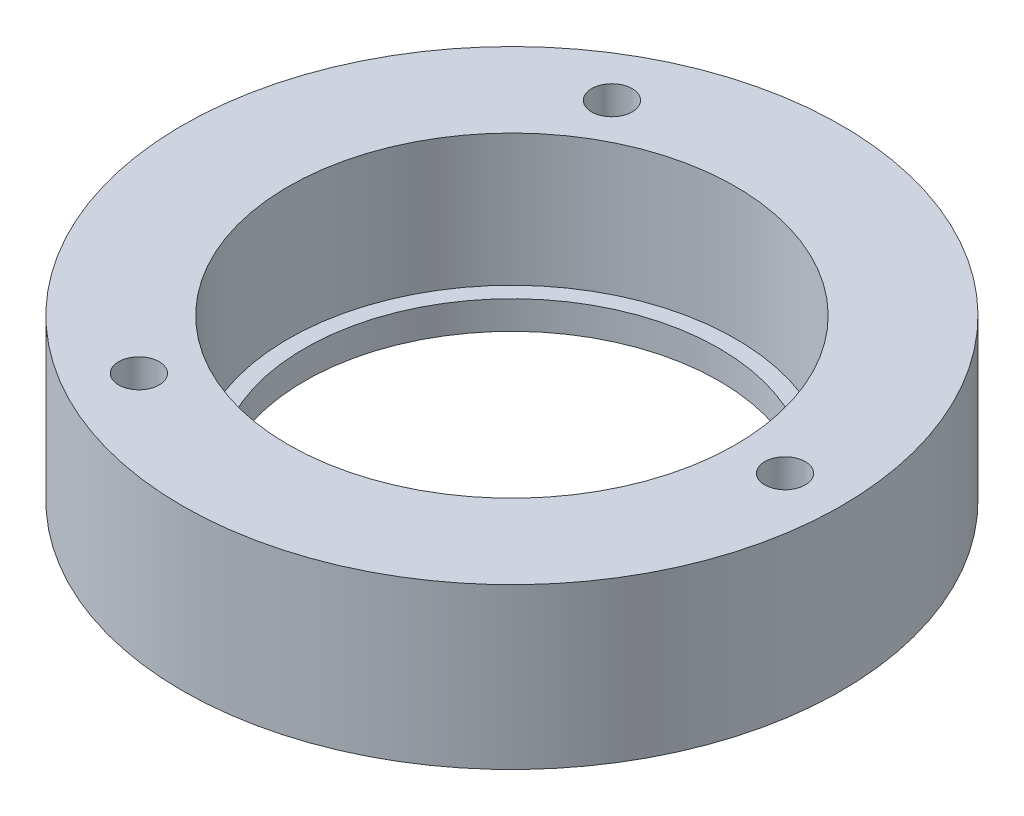
ISO-10303-21;
HEADER;
FILE_DESCRIPTION(('STEP AP214'),'2;1');
FILE_NAME('part.step','',(''),(''),'','','');
FILE_SCHEMA(('AUTOMOTIVE_DESIGN { 1 0 10303 214 1 1 1 1 }'));
ENDSEC;
DATA;
#1=APPLICATION_CONTEXT('core data for automotive mechanical design processes');
#2=APPLICATION_PROTOCOL_DEFINITION('international standard','automotive_design',2000,#1);
#3=PRODUCT_CONTEXT('',#1,'mechanical');
#4=PRODUCT('Part','Part','',(#3));
#5=PRODUCT_RELATED_PRODUCT_CATEGORY('part','',(#4));
#6=PRODUCT_DEFINITION_FORMATION('','',#4);
#7=PRODUCT_DEFINITION_CONTEXT('part definition',#1,'design');
#8=PRODUCT_DEFINITION('design','',#6,#7);
#9=PRODUCT_DEFINITION_SHAPE('','',#8);
#10=(LENGTH_UNIT() NAMED_UNIT(*) SI_UNIT(.MILLI.,.METRE.));
#11=(NAMED_UNIT(*) PLANE_ANGLE_UNIT() SI_UNIT($,.RADIAN.));
#12=(NAMED_UNIT(*) SI_UNIT($,.STERADIAN.) SOLID_ANGLE_UNIT());
#13=UNCERTAINTY_MEASURE_WITH_UNIT(LENGTH_MEASURE(1.E-05),#10,'distance_accuracy_value','');
#14=(GEOMETRIC_REPRESENTATION_CONTEXT(3) GLOBAL_UNCERTAINTY_ASSIGNED_CONTEXT((#13)) GLOBAL_UNIT_ASSIGNED_CONTEXT((#10,
#11,#12)) REPRESENTATION_CONTEXT('',''));
#15=CARTESIAN_POINT('',(0.,0.,0.));
#16=DIRECTION('',(0.,0.,1.));
#17=DIRECTION('',(1.,0.,0.));
#18=AXIS2_PLACEMENT_3D('',#15,#16,#17);
#19=CARTESIAN_POINT('',(0.,3.,0.));
#20=DIRECTION('',(0.,1.,0.));
#21=DIRECTION('',(0.,0.,1.));
#22=AXIS2_PLACEMENT_3D('',#19,#20,#21);
#23=PLANE('',#22);
#24=CARTESIAN_POINT('',(0.,3.,0.));
#25=DIRECTION('',(0.,1.,0.));
#26=DIRECTION('',(0.,0.,1.));
#27=AXIS2_PLACEMENT_3D('',#24,#25,#26);
#28=CIRCLE('',#27,22.);
#29=CARTESIAN_POINT('',(0.,3.,22.));
#30=VERTEX_POINT('',#29);
#31=EDGE_CURVE('E74',#30,#30,#28,.T.);
#32=ORIENTED_EDGE('',*,*,#31,.F.);
#33=EDGE_LOOP('',(#32));
#34=FACE_BOUND('',#33,.T.);
#35=CARTESIAN_POINT('',(0.,3.,0.));
#36=DIRECTION('',(0.,1.,0.));
#37=DIRECTION('',(0.,0.,1.));
#38=AXIS2_PLACEMENT_3D('',#35,#36,#37);
#39=CIRCLE('',#38,23.75);
#40=CARTESIAN_POINT('',(0.,3.,23.75));
#41=VERTEX_POINT('',#40);
#42=EDGE_CURVE('E65',#41,#41,#39,.T.);
#43=ORIENTED_EDGE('',*,*,#42,.T.);
#44=EDGE_LOOP('',(#43));
#45=FACE_BOUND('',#44,.T.);
#46=ADVANCED_FACE('F35',(#34,#45),#23,.T.);
#47=CARTESIAN_POINT('',(0.,0.,0.));
#48=DIRECTION('',(0.,1.,0.));
#49=DIRECTION('',(0.,0.,1.));
#50=AXIS2_PLACEMENT_3D('',#47,#48,#49);
#51=PLANE('',#50);
#52=CARTESIAN_POINT('',(-14.5000000000001,0.,25.1147367097486));
#53=DIRECTION('',(0.,1.,0.));
#54=DIRECTION('',(0.,0.,1.));
#55=AXIS2_PLACEMENT_3D('',#52,#53,#54);
#56=CIRCLE('',#55,4.15);
#57=CARTESIAN_POINT('',(-14.5000000000001,0.,29.2647367097486));
#58=VERTEX_POINT('',#57);
#59=EDGE_CURVE('E50',#58,#58,#56,.T.);
#60=ORIENTED_EDGE('',*,*,#59,.T.);
#61=EDGE_LOOP('',(#60));
#62=FACE_BOUND('',#61,.T.);
#63=CARTESIAN_POINT('',(-14.4999999999998,0.,-25.1147367097489));
#64=DIRECTION('',(0.,1.,0.));
#65=DIRECTION('',(0.,0.,1.));
#66=AXIS2_PLACEMENT_3D('',#63,#64,#65);
#67=CIRCLE('',#66,4.15);
#68=CARTESIAN_POINT('',(-14.4999999999998,0.,-20.9647367097489));
#69=VERTEX_POINT('',#68);
#70=EDGE_CURVE('E55',#69,#69,#67,.T.);
#71=ORIENTED_EDGE('',*,*,#70,.T.);
#72=EDGE_LOOP('',(#71));
#73=FACE_BOUND('',#72,.T.);
#74=CARTESIAN_POINT('',(29.,0.,0.));
#75=DIRECTION('',(0.,1.,0.));
#76=DIRECTION('',(0.,0.,1.));
#77=AXIS2_PLACEMENT_3D('',#74,#75,#76);
#78=CIRCLE('',#77,4.15);
#79=CARTESIAN_POINT('',(29.,0.,4.15));
#80=VERTEX_POINT('',#79);
#81=EDGE_CURVE('E58',#80,#80,#78,.T.);
#82=ORIENTED_EDGE('',*,*,#81,.T.);
#83=EDGE_LOOP('',(#82));
#84=FACE_BOUND('',#83,.T.);
#85=CARTESIAN_POINT('',(0.,0.,0.));
#86=DIRECTION('',(0.,1.,0.));
#87=DIRECTION('',(0.,0.,1.));
#88=AXIS2_PLACEMENT_3D('',#85,#86,#87);
#89=CIRCLE('',#88,35.);
#90=CARTESIAN_POINT('',(0.,0.,35.));
#91=VERTEX_POINT('',#90);
#92=EDGE_CURVE('E61',#91,#91,#89,.T.);
#93=ORIENTED_EDGE('',*,*,#92,.F.);
#94=EDGE_LOOP('',(#93));
#95=FACE_BOUND('',#94,.T.);
#96=CARTESIAN_POINT('',(0.,0.,0.));
#97=DIRECTION('',(0.,1.,0.));
#98=DIRECTION('',(0.,0.,1.));
#99=AXIS2_PLACEMENT_3D('',#96,#97,#98);
#100=CIRCLE('',#99,22.);
#101=CARTESIAN_POINT('',(0.,0.,22.));
#102=VERTEX_POINT('',#101);
#103=EDGE_CURVE('E75',#102,#102,#100,.T.);
#104=ORIENTED_EDGE('',*,*,#103,.T.);
#105=EDGE_LOOP('',(#104));
#106=FACE_BOUND('',#105,.T.);
#107=ADVANCED_FACE('F108',(#62,#73,#84,#95,#106),#51,.F.);
#108=CARTESIAN_POINT('',(0.,3.,0.));
#109=DIRECTION('',(0.,-1.,0.));
#110=DIRECTION('',(0.,0.,-1.));
#111=AXIS2_PLACEMENT_3D('',#108,#109,#110);
#112=CYLINDRICAL_SURFACE('',#111,35.);
#113=ORIENTED_EDGE('',*,*,#92,.T.);
#114=EDGE_LOOP('',(#113));
#115=FACE_BOUND('',#114,.T.);
#116=CARTESIAN_POINT('',(0.,17.,0.));
#117=DIRECTION('',(0.,1.,0.));
#118=DIRECTION('',(0.,0.,1.));
#119=AXIS2_PLACEMENT_3D('',#116,#117,#118);
#120=CIRCLE('',#119,35.);
#121=CARTESIAN_POINT('',(0.,17.,35.));
#122=VERTEX_POINT('',#121);
#123=EDGE_CURVE('E78',#122,#122,#120,.T.);
#124=ORIENTED_EDGE('',*,*,#123,.F.);
#125=EDGE_LOOP('',(#124));
#126=FACE_BOUND('',#125,.T.);
#127=ADVANCED_FACE('F103',(#115,#126),#112,.T.);
#128=CARTESIAN_POINT('',(0.,3.,0.));
#129=DIRECTION('',(0.,-1.,0.));
#130=DIRECTION('',(0.,0.,-1.));
#131=AXIS2_PLACEMENT_3D('',#128,#129,#130);
#132=CYLINDRICAL_SURFACE('',#131,22.);
#133=ORIENTED_EDGE('',*,*,#31,.T.);
#134=EDGE_LOOP('',(#133));
#135=FACE_BOUND('',#134,.T.);
#136=ORIENTED_EDGE('',*,*,#103,.F.);
#137=EDGE_LOOP('',(#136));
#138=FACE_BOUND('',#137,.T.);
#139=ADVANCED_FACE('F94',(#135,#138),#132,.F.);
#140=CARTESIAN_POINT('',(0.,17.,0.));
#141=DIRECTION('',(0.,1.,0.));
#142=DIRECTION('',(0.,0.,1.));
#143=AXIS2_PLACEMENT_3D('',#140,#141,#142);
#144=PLANE('',#143);
#145=CARTESIAN_POINT('',(29.,17.,0.));
#146=DIRECTION('',(0.,1.,0.));
#147=DIRECTION('',(0.,0.,1.));
#148=AXIS2_PLACEMENT_3D('',#145,#146,#147);
#149=CIRCLE('',#148,2.15);
#150=CARTESIAN_POINT('',(29.,17.,2.15));
#151=VERTEX_POINT('',#150);
#152=EDGE_CURVE('E62',#151,#151,#149,.F.);
#153=ORIENTED_EDGE('',*,*,#152,.T.);
#154=EDGE_LOOP('',(#153));
#155=FACE_BOUND('',#154,.T.);
#156=CARTESIAN_POINT('',(-14.5000000000001,17.,25.1147367097486));
#157=DIRECTION('',(0.,1.,0.));
#158=DIRECTION('',(0.,0.,1.));
#159=AXIS2_PLACEMENT_3D('',#156,#157,#158);
#160=CIRCLE('',#159,2.15);
#161=CARTESIAN_POINT('',(-14.5000000000001,17.,27.2647367097486));
#162=VERTEX_POINT('',#161);
#163=EDGE_CURVE('E66',#162,#162,#160,.F.);
#164=ORIENTED_EDGE('',*,*,#163,.T.);
#165=EDGE_LOOP('',(#164));
#166=FACE_BOUND('',#165,.T.);
#167=CARTESIAN_POINT('',(-14.4999999999998,17.,-25.1147367097489));
#168=DIRECTION('',(0.,1.,0.));
#169=DIRECTION('',(0.,0.,1.));
#170=AXIS2_PLACEMENT_3D('',#167,#168,#169);
#171=CIRCLE('',#170,2.15);
#172=CARTESIAN_POINT('',(-14.4999999999998,17.,-22.9647367097489));
#173=VERTEX_POINT('',#172);
#174=EDGE_CURVE('E69',#173,#173,#171,.F.);
#175=ORIENTED_EDGE('',*,*,#174,.T.);
#176=EDGE_LOOP('',(#175));
#177=FACE_BOUND('',#176,.T.);
#178=ORIENTED_EDGE('',*,*,#123,.T.);
#179=EDGE_LOOP('',(#178));
#180=FACE_BOUND('',#179,.T.);
#181=CARTESIAN_POINT('',(0.,17.,0.));
#182=DIRECTION('',(0.,1.,0.));
#183=DIRECTION('',(0.,0.,1.));
#184=AXIS2_PLACEMENT_3D('',#181,#182,#183);
#185=CIRCLE('',#184,23.75);
#186=CARTESIAN_POINT('',(0.,17.,23.75));
#187=VERTEX_POINT('',#186);
#188=EDGE_CURVE('E83',#187,#187,#185,.T.);
#189=ORIENTED_EDGE('',*,*,#188,.F.);
#190=EDGE_LOOP('',(#189));
#191=FACE_BOUND('',#190,.T.);
#192=ADVANCED_FACE('F92',(#155,#166,#177,#180,#191),#144,.T.);
#193=CARTESIAN_POINT('',(0.,17.,0.));
#194=DIRECTION('',(0.,-1.,0.));
#195=DIRECTION('',(0.,0.,-1.));
#196=AXIS2_PLACEMENT_3D('',#193,#194,#195);
#197=CYLINDRICAL_SURFACE('',#196,23.75);
#198=ORIENTED_EDGE('',*,*,#188,.T.);
#199=EDGE_LOOP('',(#198));
#200=FACE_BOUND('',#199,.T.);
#201=ORIENTED_EDGE('',*,*,#42,.F.);
#202=EDGE_LOOP('',(#201));
#203=FACE_BOUND('',#202,.T.);
#204=ADVANCED_FACE('F89',(#200,#203),#197,.F.);
#205=CARTESIAN_POINT('',(-14.4999999999998,70.,-25.1147367097489));
#206=DIRECTION('',(0.,-1.,0.));
#207=DIRECTION('',(0.,0.,-1.));
#208=AXIS2_PLACEMENT_3D('',#205,#206,#207);
#209=CYLINDRICAL_SURFACE('',#208,2.15);
#210=CARTESIAN_POINT('',(-14.4999999999998,2.,-25.1147367097489));
#211=DIRECTION('',(0.,1.,0.));
#212=DIRECTION('',(0.,0.,1.));
#213=AXIS2_PLACEMENT_3D('',#210,#211,#212);
#214=CIRCLE('',#213,2.15);
#215=CARTESIAN_POINT('',(-14.4999999999998,2.,-22.9647367097489));
#216=VERTEX_POINT('',#215);
#217=EDGE_CURVE('E42',#216,#216,#214,.F.);
#218=ORIENTED_EDGE('',*,*,#217,.T.);
#219=EDGE_LOOP('',(#218));
#220=FACE_BOUND('',#219,.T.);
#221=ORIENTED_EDGE('',*,*,#174,.F.);
#222=EDGE_LOOP('',(#221));
#223=FACE_BOUND('',#222,.T.);
#224=ADVANCED_FACE('F101',(#220,#223),#209,.F.);
#225=CARTESIAN_POINT('',(-14.5000000000001,70.,25.1147367097486));
#226=DIRECTION('',(0.,-1.,0.));
#227=DIRECTION('',(0.,0.,-1.));
#228=AXIS2_PLACEMENT_3D('',#225,#226,#227);
#229=CYLINDRICAL_SURFACE('',#228,2.15);
#230=CARTESIAN_POINT('',(-14.5000000000001,2.,25.1147367097486));
#231=DIRECTION('',(0.,1.,0.));
#232=DIRECTION('',(0.,0.,1.));
#233=AXIS2_PLACEMENT_3D('',#230,#231,#232);
#234=CIRCLE('',#233,2.15);
#235=CARTESIAN_POINT('',(-14.5000000000001,2.,27.2647367097486));
#236=VERTEX_POINT('',#235);
#237=EDGE_CURVE('E46',#236,#236,#234,.F.);
#238=ORIENTED_EDGE('',*,*,#237,.T.);
#239=EDGE_LOOP('',(#238));
#240=FACE_BOUND('',#239,.T.);
#241=ORIENTED_EDGE('',*,*,#163,.F.);
#242=EDGE_LOOP('',(#241));
#243=FACE_BOUND('',#242,.T.);
#244=ADVANCED_FACE('F168',(#240,#243),#229,.F.);
#245=CARTESIAN_POINT('',(29.,70.,0.));
#246=DIRECTION('',(0.,-1.,0.));
#247=DIRECTION('',(0.,0.,-1.));
#248=AXIS2_PLACEMENT_3D('',#245,#246,#247);
#249=CYLINDRICAL_SURFACE('',#248,2.15);
#250=CARTESIAN_POINT('',(29.,2.,0.));
#251=DIRECTION('',(0.,1.,0.));
#252=DIRECTION('',(0.,0.,1.));
#253=AXIS2_PLACEMENT_3D('',#250,#251,#252);
#254=CIRCLE('',#253,2.15);
#255=CARTESIAN_POINT('',(29.,2.,2.15));
#256=VERTEX_POINT('',#255);
#257=EDGE_CURVE('E10',#256,#256,#254,.F.);
#258=ORIENTED_EDGE('',*,*,#257,.T.);
#259=EDGE_LOOP('',(#258));
#260=FACE_BOUND('',#259,.T.);
#261=ORIENTED_EDGE('',*,*,#152,.F.);
#262=EDGE_LOOP('',(#261));
#263=FACE_BOUND('',#262,.T.);
#264=ADVANCED_FACE('F125',(#260,#263),#249,.F.);
#265=CARTESIAN_POINT('',(-14.5000000000001,2.,25.1147367097486));
#266=DIRECTION('',(0.,1.,0.));
#267=DIRECTION('',(0.,0.,1.));
#268=AXIS2_PLACEMENT_3D('',#265,#266,#267);
#269=TOROIDAL_SURFACE('',#268,4.15,2.);
#270=ORIENTED_EDGE('',*,*,#237,.F.);
#271=EDGE_LOOP('',(#270));
#272=FACE_BOUND('',#271,.T.);
#273=ORIENTED_EDGE('',*,*,#59,.F.);
#274=EDGE_LOOP('',(#273));
#275=FACE_BOUND('',#274,.T.);
#276=ADVANCED_FACE('F122',(#272,#275),#269,.T.);
#277=CARTESIAN_POINT('',(-14.4999999999998,2.,-25.1147367097489));
#278=DIRECTION('',(0.,1.,0.));
#279=DIRECTION('',(0.,0.,1.));
#280=AXIS2_PLACEMENT_3D('',#277,#278,#279);
#281=TOROIDAL_SURFACE('',#280,4.15,2.);
#282=ORIENTED_EDGE('',*,*,#217,.F.);
#283=EDGE_LOOP('',(#282));
#284=FACE_BOUND('',#283,.T.);
#285=ORIENTED_EDGE('',*,*,#70,.F.);
#286=EDGE_LOOP('',(#285));
#287=FACE_BOUND('',#286,.T.);
#288=ADVANCED_FACE('F124',(#284,#287),#281,.T.);
#289=CARTESIAN_POINT('',(29.,2.,0.));
#290=DIRECTION('',(0.,1.,0.));
#291=DIRECTION('',(0.,0.,1.));
#292=AXIS2_PLACEMENT_3D('',#289,#290,#291);
#293=TOROIDAL_SURFACE('',#292,4.15,2.);
#294=ORIENTED_EDGE('',*,*,#257,.F.);
#295=EDGE_LOOP('',(#294));
#296=FACE_BOUND('',#295,.T.);
#297=ORIENTED_EDGE('',*,*,#81,.F.);
#298=EDGE_LOOP('',(#297));
#299=FACE_BOUND('',#298,.T.);
#300=ADVANCED_FACE('F37',(#296,#299),#293,.T.);
#301=CLOSED_SHELL('',(#46,#107,#127,#139,#192,#204,#224,#244,#264,#276,#288,#300));
#302=MANIFOLD_SOLID_BREP('B2',#301);
#303=ADVANCED_BREP_SHAPE_REPRESENTATION('',(#18,#302),#14);
#304=SHAPE_DEFINITION_REPRESENTATION(#9,#303);
ENDSEC;
END-ISO-10303-21;
